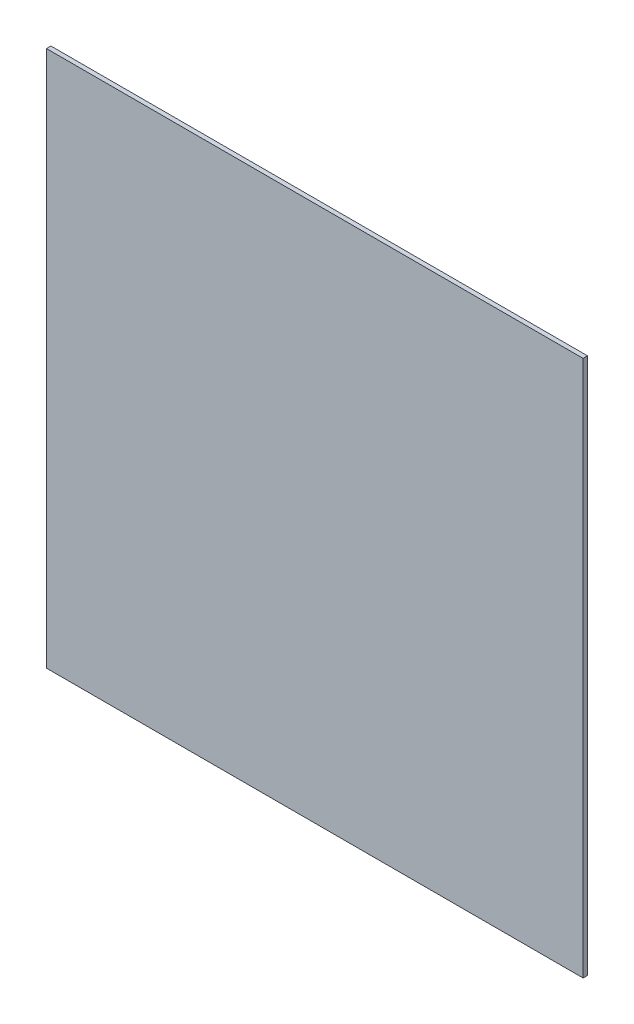
ISO-10303-21;
HEADER;
FILE_DESCRIPTION(('STEP AP214'),'2;1');
FILE_NAME('part.step','',(''),(''),'','','');
FILE_SCHEMA(('AUTOMOTIVE_DESIGN { 1 0 10303 214 1 1 1 1 }'));
ENDSEC;
DATA;
#1=APPLICATION_CONTEXT('core data for automotive mechanical design processes');
#2=APPLICATION_PROTOCOL_DEFINITION('international standard','automotive_design',2000,#1);
#3=PRODUCT_CONTEXT('',#1,'mechanical');
#4=PRODUCT('Part','Part','',(#3));
#5=PRODUCT_RELATED_PRODUCT_CATEGORY('part','',(#4));
#6=PRODUCT_DEFINITION_FORMATION('','',#4);
#7=PRODUCT_DEFINITION_CONTEXT('part definition',#1,'design');
#8=PRODUCT_DEFINITION('design','',#6,#7);
#9=PRODUCT_DEFINITION_SHAPE('','',#8);
#10=(LENGTH_UNIT() NAMED_UNIT(*) SI_UNIT(.MILLI.,.METRE.));
#11=(NAMED_UNIT(*) PLANE_ANGLE_UNIT() SI_UNIT($,.RADIAN.));
#12=(NAMED_UNIT(*) SI_UNIT($,.STERADIAN.) SOLID_ANGLE_UNIT());
#13=UNCERTAINTY_MEASURE_WITH_UNIT(LENGTH_MEASURE(1.E-05),#10,'distance_accuracy_value','');
#14=(GEOMETRIC_REPRESENTATION_CONTEXT(3) GLOBAL_UNCERTAINTY_ASSIGNED_CONTEXT((#13)) GLOBAL_UNIT_ASSIGNED_CONTEXT((#10,
#11,#12)) REPRESENTATION_CONTEXT('',''));
#15=CARTESIAN_POINT('',(0.,0.,0.));
#16=DIRECTION('',(0.,0.,1.));
#17=DIRECTION('',(1.,0.,0.));
#18=AXIS2_PLACEMENT_3D('',#15,#16,#17);
#19=CARTESIAN_POINT('',(-60.5,60.5,1.));
#20=DIRECTION('',(1.,0.,0.));
#21=DIRECTION('',(0.,0.,-1.));
#22=AXIS2_PLACEMENT_3D('',#19,#20,#21);
#23=PLANE('',#22);
#24=DIRECTION('',(0.,-1.,0.));
#25=VECTOR('',#24,1.);
#26=CARTESIAN_POINT('',(-60.5,60.5,0.));
#27=LINE('',#26,#25);
#28=CARTESIAN_POINT('',(-60.5,60.5,0.));
#29=VERTEX_POINT('',#28);
#30=CARTESIAN_POINT('',(-60.5,-60.5,0.));
#31=VERTEX_POINT('',#30);
#32=EDGE_CURVE('E96',#29,#31,#27,.T.);
#33=ORIENTED_EDGE('',*,*,#32,.T.);
#34=DIRECTION('',(0.,0.,-1.));
#35=VECTOR('',#34,1.);
#36=CARTESIAN_POINT('',(-60.5,-60.5,1.));
#37=LINE('',#36,#35);
#38=CARTESIAN_POINT('',(-60.5,-60.5,1.));
#39=VERTEX_POINT('',#38);
#40=EDGE_CURVE('E11',#39,#31,#37,.T.);
#41=ORIENTED_EDGE('',*,*,#40,.F.);
#42=DIRECTION('',(0.,-1.,0.));
#43=VECTOR('',#42,1.);
#44=CARTESIAN_POINT('',(-60.5,60.5,1.));
#45=LINE('',#44,#43);
#46=CARTESIAN_POINT('',(-60.5,60.5,1.));
#47=VERTEX_POINT('',#46);
#48=EDGE_CURVE('E84',#47,#39,#45,.T.);
#49=ORIENTED_EDGE('',*,*,#48,.F.);
#50=DIRECTION('',(0.,0.,-1.));
#51=VECTOR('',#50,1.);
#52=CARTESIAN_POINT('',(-60.5,60.5,1.));
#53=LINE('',#52,#51);
#54=EDGE_CURVE('E92',#47,#29,#53,.T.);
#55=ORIENTED_EDGE('',*,*,#54,.T.);
#56=EDGE_LOOP('',(#33,#41,#49,#55));
#57=FACE_BOUND('',#56,.T.);
#58=ADVANCED_FACE('F33',(#57),#23,.F.);
#59=CARTESIAN_POINT('',(-60.5,-60.5,1.));
#60=DIRECTION('',(0.,1.,0.));
#61=DIRECTION('',(0.,0.,1.));
#62=AXIS2_PLACEMENT_3D('',#59,#60,#61);
#63=PLANE('',#62);
#64=DIRECTION('',(1.,0.,0.));
#65=VECTOR('',#64,1.);
#66=CARTESIAN_POINT('',(-60.5,-60.5,0.));
#67=LINE('',#66,#65);
#68=CARTESIAN_POINT('',(60.5,-60.5,0.));
#69=VERTEX_POINT('',#68);
#70=EDGE_CURVE('E88',#31,#69,#67,.T.);
#71=ORIENTED_EDGE('',*,*,#70,.T.);
#72=DIRECTION('',(0.,0.,-1.));
#73=VECTOR('',#72,1.);
#74=CARTESIAN_POINT('',(60.5,-60.5,1.));
#75=LINE('',#74,#73);
#76=CARTESIAN_POINT('',(60.5,-60.5,1.));
#77=VERTEX_POINT('',#76);
#78=EDGE_CURVE('E41',#77,#69,#75,.T.);
#79=ORIENTED_EDGE('',*,*,#78,.F.);
#80=DIRECTION('',(1.,0.,0.));
#81=VECTOR('',#80,1.);
#82=CARTESIAN_POINT('',(-60.5,-60.5,1.));
#83=LINE('',#82,#81);
#84=EDGE_CURVE('E79',#39,#77,#83,.T.);
#85=ORIENTED_EDGE('',*,*,#84,.F.);
#86=ORIENTED_EDGE('',*,*,#40,.T.);
#87=EDGE_LOOP('',(#71,#79,#85,#86));
#88=FACE_BOUND('',#87,.T.);
#89=ADVANCED_FACE('F87',(#88),#63,.F.);
#90=CARTESIAN_POINT('',(60.5,-60.5,1.));
#91=DIRECTION('',(-1.,0.,0.));
#92=DIRECTION('',(0.,0.,1.));
#93=AXIS2_PLACEMENT_3D('',#90,#91,#92);
#94=PLANE('',#93);
#95=DIRECTION('',(0.,1.,0.));
#96=VECTOR('',#95,1.);
#97=CARTESIAN_POINT('',(60.5,-60.5,0.));
#98=LINE('',#97,#96);
#99=CARTESIAN_POINT('',(60.5,60.5,0.));
#100=VERTEX_POINT('',#99);
#101=EDGE_CURVE('E66',#69,#100,#98,.T.);
#102=ORIENTED_EDGE('',*,*,#101,.T.);
#103=DIRECTION('',(0.,0.,-1.));
#104=VECTOR('',#103,1.);
#105=CARTESIAN_POINT('',(60.5,60.5,1.));
#106=LINE('',#105,#104);
#107=CARTESIAN_POINT('',(60.5,60.5,1.));
#108=VERTEX_POINT('',#107);
#109=EDGE_CURVE('E89',#108,#100,#106,.T.);
#110=ORIENTED_EDGE('',*,*,#109,.F.);
#111=DIRECTION('',(0.,1.,0.));
#112=VECTOR('',#111,1.);
#113=CARTESIAN_POINT('',(60.5,-60.5,1.));
#114=LINE('',#113,#112);
#115=EDGE_CURVE('E82',#77,#108,#114,.T.);
#116=ORIENTED_EDGE('',*,*,#115,.F.);
#117=ORIENTED_EDGE('',*,*,#78,.T.);
#118=EDGE_LOOP('',(#102,#110,#116,#117));
#119=FACE_BOUND('',#118,.T.);
#120=ADVANCED_FACE('F90',(#119),#94,.F.);
#121=CARTESIAN_POINT('',(60.5,60.5,1.));
#122=DIRECTION('',(0.,-1.,0.));
#123=DIRECTION('',(0.,0.,-1.));
#124=AXIS2_PLACEMENT_3D('',#121,#122,#123);
#125=PLANE('',#124);
#126=DIRECTION('',(-1.,0.,0.));
#127=VECTOR('',#126,1.);
#128=CARTESIAN_POINT('',(60.5,60.5,0.));
#129=LINE('',#128,#127);
#130=EDGE_CURVE('E72',#100,#29,#129,.T.);
#131=ORIENTED_EDGE('',*,*,#130,.T.);
#132=ORIENTED_EDGE('',*,*,#54,.F.);
#133=DIRECTION('',(-1.,0.,0.));
#134=VECTOR('',#133,1.);
#135=CARTESIAN_POINT('',(60.5,60.5,1.));
#136=LINE('',#135,#134);
#137=EDGE_CURVE('E49',#108,#47,#136,.T.);
#138=ORIENTED_EDGE('',*,*,#137,.F.);
#139=ORIENTED_EDGE('',*,*,#109,.T.);
#140=EDGE_LOOP('',(#131,#132,#138,#139));
#141=FACE_BOUND('',#140,.T.);
#142=ADVANCED_FACE('F103',(#141),#125,.F.);
#143=CARTESIAN_POINT('',(0.,0.,1.));
#144=DIRECTION('',(0.,0.,1.));
#145=DIRECTION('',(1.,0.,0.));
#146=AXIS2_PLACEMENT_3D('',#143,#144,#145);
#147=PLANE('',#146);
#148=ORIENTED_EDGE('',*,*,#48,.T.);
#149=ORIENTED_EDGE('',*,*,#84,.T.);
#150=ORIENTED_EDGE('',*,*,#115,.T.);
#151=ORIENTED_EDGE('',*,*,#137,.T.);
#152=EDGE_LOOP('',(#148,#149,#150,#151));
#153=FACE_BOUND('',#152,.T.);
#154=ADVANCED_FACE('F80',(#153),#147,.T.);
#155=CARTESIAN_POINT('',(0.,0.,0.));
#156=DIRECTION('',(0.,0.,1.));
#157=DIRECTION('',(1.,0.,0.));
#158=AXIS2_PLACEMENT_3D('',#155,#156,#157);
#159=PLANE('',#158);
#160=ORIENTED_EDGE('',*,*,#32,.F.);
#161=ORIENTED_EDGE('',*,*,#130,.F.);
#162=ORIENTED_EDGE('',*,*,#101,.F.);
#163=ORIENTED_EDGE('',*,*,#70,.F.);
#164=EDGE_LOOP('',(#160,#161,#162,#163));
#165=FACE_BOUND('',#164,.T.);
#166=ADVANCED_FACE('F106',(#165),#159,.F.);
#167=CLOSED_SHELL('',(#58,#89,#120,#142,#154,#166));
#168=MANIFOLD_SOLID_BREP('B2',#167);
#169=ADVANCED_BREP_SHAPE_REPRESENTATION('',(#18,#168),#14);
#170=SHAPE_DEFINITION_REPRESENTATION(#9,#169);
ENDSEC;
END-ISO-10303-21;
